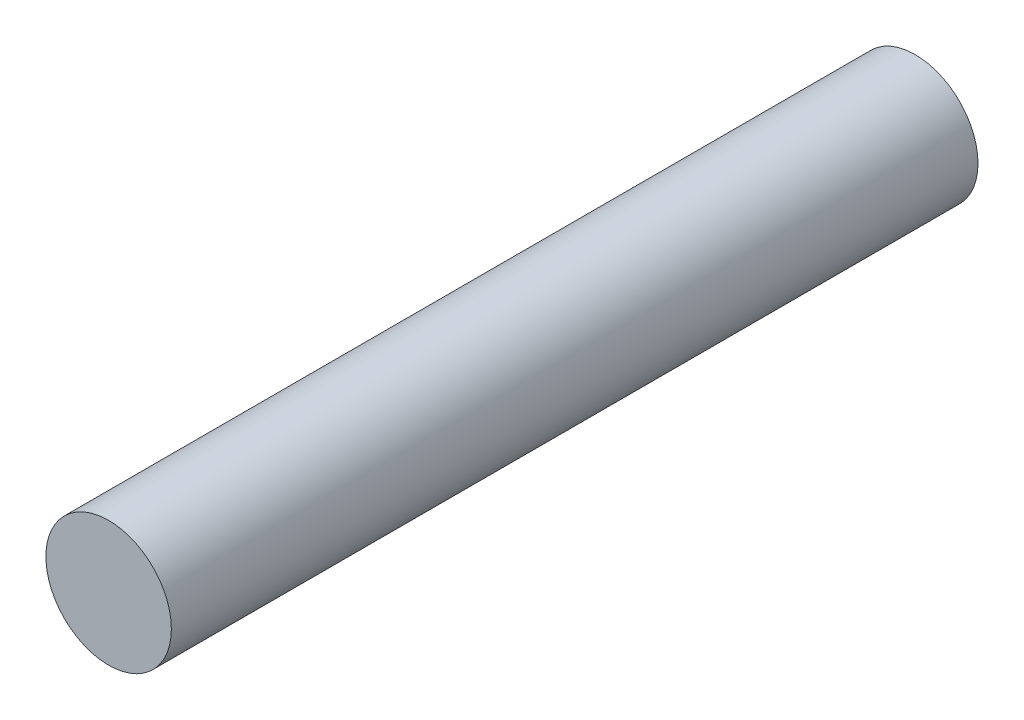
ISO-10303-21;
HEADER;
FILE_DESCRIPTION(('STEP AP214'),'2;1');
FILE_NAME('part.step','',(''),(''),'','','');
FILE_SCHEMA(('AUTOMOTIVE_DESIGN { 1 0 10303 214 1 1 1 1 }'));
ENDSEC;
DATA;
#1=APPLICATION_CONTEXT('core data for automotive mechanical design processes');
#2=APPLICATION_PROTOCOL_DEFINITION('international standard','automotive_design',2000,#1);
#3=PRODUCT_CONTEXT('',#1,'mechanical');
#4=PRODUCT('Part','Part','',(#3));
#5=PRODUCT_RELATED_PRODUCT_CATEGORY('part','',(#4));
#6=PRODUCT_DEFINITION_FORMATION('','',#4);
#7=PRODUCT_DEFINITION_CONTEXT('part definition',#1,'design');
#8=PRODUCT_DEFINITION('design','',#6,#7);
#9=PRODUCT_DEFINITION_SHAPE('','',#8);
#10=(LENGTH_UNIT() NAMED_UNIT(*) SI_UNIT(.MILLI.,.METRE.));
#11=(NAMED_UNIT(*) PLANE_ANGLE_UNIT() SI_UNIT($,.RADIAN.));
#12=(NAMED_UNIT(*) SI_UNIT($,.STERADIAN.) SOLID_ANGLE_UNIT());
#13=UNCERTAINTY_MEASURE_WITH_UNIT(LENGTH_MEASURE(1.E-05),#10,'distance_accuracy_value','');
#14=(GEOMETRIC_REPRESENTATION_CONTEXT(3) GLOBAL_UNCERTAINTY_ASSIGNED_CONTEXT((#13)) GLOBAL_UNIT_ASSIGNED_CONTEXT((#10,
#11,#12)) REPRESENTATION_CONTEXT('',''));
#15=CARTESIAN_POINT('',(0.,0.,0.));
#16=DIRECTION('',(0.,0.,1.));
#17=DIRECTION('',(1.,0.,0.));
#18=AXIS2_PLACEMENT_3D('',#15,#16,#17);
#19=CARTESIAN_POINT('',(0.,0.,11.43));
#20=DIRECTION('',(0.,0.,-1.));
#21=DIRECTION('',(-1.,0.,0.));
#22=AXIS2_PLACEMENT_3D('',#19,#20,#21);
#23=CYLINDRICAL_SURFACE('',#22,1.778);
#24=CARTESIAN_POINT('',(0.,0.,11.43));
#25=DIRECTION('',(0.,0.,1.));
#26=DIRECTION('',(1.,0.,0.));
#27=AXIS2_PLACEMENT_3D('',#24,#25,#26);
#28=CIRCLE('',#27,1.778);
#29=CARTESIAN_POINT('',(1.778,0.,11.43));
#30=VERTEX_POINT('',#29);
#31=EDGE_CURVE('E10',#30,#30,#28,.T.);
#32=ORIENTED_EDGE('',*,*,#31,.F.);
#33=EDGE_LOOP('',(#32));
#34=FACE_BOUND('',#33,.T.);
#35=CARTESIAN_POINT('',(0.,0.,-11.43));
#36=DIRECTION('',(0.,0.,1.));
#37=DIRECTION('',(1.,0.,0.));
#38=AXIS2_PLACEMENT_3D('',#35,#36,#37);
#39=CIRCLE('',#38,1.778);
#40=CARTESIAN_POINT('',(1.778,0.,-11.43));
#41=VERTEX_POINT('',#40);
#42=EDGE_CURVE('E38',#41,#41,#39,.T.);
#43=ORIENTED_EDGE('',*,*,#42,.T.);
#44=EDGE_LOOP('',(#43));
#45=FACE_BOUND('',#44,.T.);
#46=ADVANCED_FACE('F35',(#34,#45),#23,.T.);
#47=CARTESIAN_POINT('',(0.,0.,11.43));
#48=DIRECTION('',(0.,0.,1.));
#49=DIRECTION('',(1.,0.,0.));
#50=AXIS2_PLACEMENT_3D('',#47,#48,#49);
#51=PLANE('',#50);
#52=ORIENTED_EDGE('',*,*,#31,.T.);
#53=EDGE_LOOP('',(#52));
#54=FACE_BOUND('',#53,.T.);
#55=ADVANCED_FACE('F50',(#54),#51,.T.);
#56=CARTESIAN_POINT('',(0.,0.,-11.43));
#57=DIRECTION('',(0.,0.,1.));
#58=DIRECTION('',(1.,0.,0.));
#59=AXIS2_PLACEMENT_3D('',#56,#57,#58);
#60=PLANE('',#59);
#61=ORIENTED_EDGE('',*,*,#42,.F.);
#62=EDGE_LOOP('',(#61));
#63=FACE_BOUND('',#62,.T.);
#64=ADVANCED_FACE('F48',(#63),#60,.F.);
#65=CLOSED_SHELL('',(#46,#55,#64));
#66=MANIFOLD_SOLID_BREP('B2',#65);
#67=ADVANCED_BREP_SHAPE_REPRESENTATION('',(#18,#66),#14);
#68=SHAPE_DEFINITION_REPRESENTATION(#9,#67);
ENDSEC;
END-ISO-10303-21;
